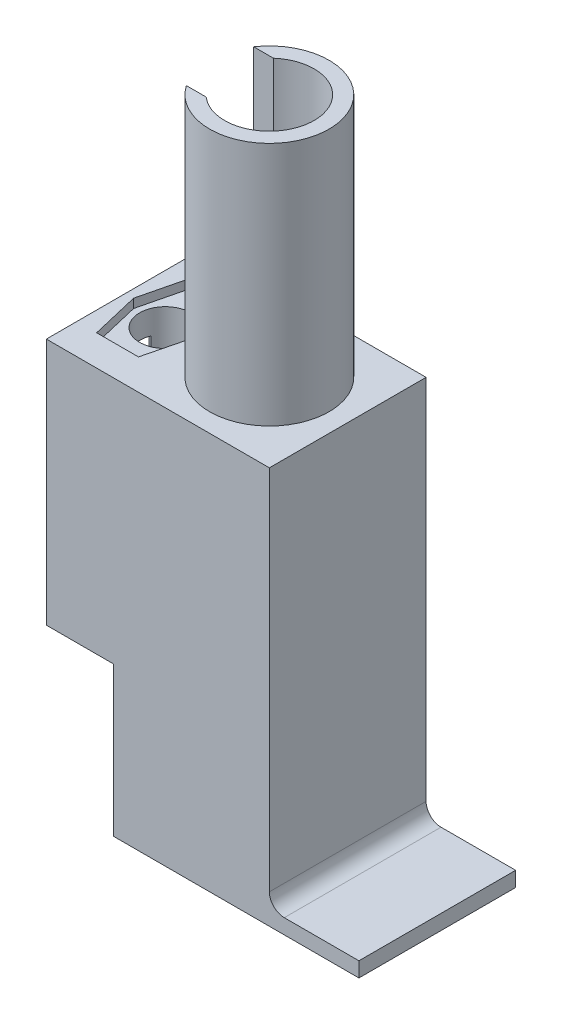
ISO-10303-21;
HEADER;
FILE_DESCRIPTION(('STEP AP214'),'2;1');
FILE_NAME('part.step','',(''),(''),'','','');
FILE_SCHEMA(('AUTOMOTIVE_DESIGN { 1 0 10303 214 1 1 1 1 }'));
ENDSEC;
DATA;
#1=APPLICATION_CONTEXT('core data for automotive mechanical design processes');
#2=APPLICATION_PROTOCOL_DEFINITION('international standard','automotive_design',2000,#1);
#3=PRODUCT_CONTEXT('',#1,'mechanical');
#4=PRODUCT('Part','Part','',(#3));
#5=PRODUCT_RELATED_PRODUCT_CATEGORY('part','',(#4));
#6=PRODUCT_DEFINITION_FORMATION('','',#4);
#7=PRODUCT_DEFINITION_CONTEXT('part definition',#1,'design');
#8=PRODUCT_DEFINITION('design','',#6,#7);
#9=PRODUCT_DEFINITION_SHAPE('','',#8);
#10=(LENGTH_UNIT() NAMED_UNIT(*) SI_UNIT(.MILLI.,.METRE.));
#11=(NAMED_UNIT(*) PLANE_ANGLE_UNIT() SI_UNIT($,.RADIAN.));
#12=(NAMED_UNIT(*) SI_UNIT($,.STERADIAN.) SOLID_ANGLE_UNIT());
#13=UNCERTAINTY_MEASURE_WITH_UNIT(LENGTH_MEASURE(1.E-05),#10,'distance_accuracy_value','');
#14=(GEOMETRIC_REPRESENTATION_CONTEXT(3) GLOBAL_UNCERTAINTY_ASSIGNED_CONTEXT((#13)) GLOBAL_UNIT_ASSIGNED_CONTEXT((#10,
#11,#12)) REPRESENTATION_CONTEXT('',''));
#15=CARTESIAN_POINT('',(0.,0.,0.));
#16=DIRECTION('',(0.,0.,1.));
#17=DIRECTION('',(1.,0.,0.));
#18=AXIS2_PLACEMENT_3D('',#15,#16,#17);
#19=CARTESIAN_POINT('',(0.,83.,0.));
#20=DIRECTION('',(0.,1.,0.));
#21=DIRECTION('',(0.,0.,1.));
#22=AXIS2_PLACEMENT_3D('',#19,#20,#21);
#23=PLANE('',#22);
#24=DIRECTION('',(1.,0.,0.));
#25=VECTOR('',#24,1.);
#26=CARTESIAN_POINT('',(-30.75,83.,16.));
#27=LINE('',#26,#25);
#28=CARTESIAN_POINT('',(-30.75,83.,16.));
#29=VERTEX_POINT('',#28);
#30=CARTESIAN_POINT('',(-16.75,83.,16.));
#31=VERTEX_POINT('',#30);
#32=EDGE_CURVE('E281',#29,#31,#27,.T.);
#33=ORIENTED_EDGE('',*,*,#32,.F.);
#34=DIRECTION('',(-0.230534425709279,0.,-0.973064169807363));
#35=VECTOR('',#34,1.);
#36=CARTESIAN_POINT('',(-30.75,83.,16.));
#37=LINE('',#36,#35);
#38=CARTESIAN_POINT('',(-34.5964592664,83.,-0.235543482244875));
#39=VERTEX_POINT('',#38);
#40=EDGE_CURVE('E66',#29,#39,#37,.T.);
#41=ORIENTED_EDGE('',*,*,#40,.T.);
#42=DIRECTION('',(-0.237041675476932,0.,0.971499482288636));
#43=VECTOR('',#42,1.);
#44=CARTESIAN_POINT('',(-30.75,83.,-16.));
#45=LINE('',#44,#43);
#46=CARTESIAN_POINT('',(-30.75,83.,-16.));
#47=VERTEX_POINT('',#46);
#48=EDGE_CURVE('E302',#47,#39,#45,.T.);
#49=ORIENTED_EDGE('',*,*,#48,.F.);
#50=DIRECTION('',(1.,0.,0.));
#51=VECTOR('',#50,1.);
#52=CARTESIAN_POINT('',(-30.75,83.,-16.));
#53=LINE('',#52,#51);
#54=CARTESIAN_POINT('',(-16.75,83.,-16.));
#55=VERTEX_POINT('',#54);
#56=EDGE_CURVE('E306',#47,#55,#53,.T.);
#57=ORIENTED_EDGE('',*,*,#56,.T.);
#58=DIRECTION('',(0.238368548536273,0.,0.971174770609652));
#59=VECTOR('',#58,1.);
#60=CARTESIAN_POINT('',(-16.75,83.,-16.));
#61=LINE('',#60,#59);
#62=CARTESIAN_POINT('',(-12.7885380264449,83.,0.140014893201441));
#63=VERTEX_POINT('',#62);
#64=EDGE_CURVE('E310',#55,#63,#61,.T.);
#65=ORIENTED_EDGE('',*,*,#64,.T.);
#66=DIRECTION('',(0.242332135649576,0.,-0.970193349818228));
#67=VECTOR('',#66,1.);
#68=CARTESIAN_POINT('',(-16.75,83.,16.));
#69=LINE('',#68,#67);
#70=EDGE_CURVE('E314',#31,#63,#69,.T.);
#71=ORIENTED_EDGE('',*,*,#70,.F.);
#72=EDGE_LOOP('',(#33,#41,#49,#57,#65,#71));
#73=FACE_BOUND('',#72,.T.);
#74=DIRECTION('',(0.,0.,-1.));
#75=VECTOR('',#74,1.);
#76=CARTESIAN_POINT('',(37.35,83.,-26.25));
#77=LINE('',#76,#75);
#78=CARTESIAN_POINT('',(37.35,83.,26.25));
#79=VERTEX_POINT('',#78);
#80=CARTESIAN_POINT('',(37.35,83.,-26.25));
#81=VERTEX_POINT('',#80);
#82=EDGE_CURVE('E487',#79,#81,#77,.T.);
#83=ORIENTED_EDGE('',*,*,#82,.T.);
#84=DIRECTION('',(-1.,0.,0.));
#85=VECTOR('',#84,1.);
#86=CARTESIAN_POINT('',(-37.35,83.,-26.25));
#87=LINE('',#86,#85);
#88=CARTESIAN_POINT('',(-37.35,83.,-26.25));
#89=VERTEX_POINT('',#88);
#90=EDGE_CURVE('E491',#81,#89,#87,.T.);
#91=ORIENTED_EDGE('',*,*,#90,.T.);
#92=DIRECTION('',(0.,0.,1.));
#93=VECTOR('',#92,1.);
#94=CARTESIAN_POINT('',(-37.35,83.,-26.25));
#95=LINE('',#94,#93);
#96=CARTESIAN_POINT('',(-37.35,83.,26.25));
#97=VERTEX_POINT('',#96);
#98=EDGE_CURVE('E495',#89,#97,#95,.T.);
#99=ORIENTED_EDGE('',*,*,#98,.T.);
#100=DIRECTION('',(1.,0.,0.));
#101=VECTOR('',#100,1.);
#102=CARTESIAN_POINT('',(-37.35,83.,26.25));
#103=LINE('',#102,#101);
#104=EDGE_CURVE('E498',#97,#79,#103,.T.);
#105=ORIENTED_EDGE('',*,*,#104,.T.);
#106=EDGE_LOOP('',(#83,#91,#99,#105));
#107=FACE_BOUND('',#106,.T.);
#108=CARTESIAN_POINT('',(11.1,83.,0.));
#109=DIRECTION('',(0.,1.,0.));
#110=DIRECTION('',(0.,0.,1.));
#111=AXIS2_PLACEMENT_3D('',#108,#109,#110);
#112=CIRCLE('',#111,20.);
#113=CARTESIAN_POINT('',(-5.42322625802538,83.,11.2686731262425));
#114=VERTEX_POINT('',#113);
#115=CARTESIAN_POINT('',(-5.42322625802539,83.,-11.2686731262425));
#116=VERTEX_POINT('',#115);
#117=EDGE_CURVE('E262',#114,#116,#112,.T.);
#118=ORIENTED_EDGE('',*,*,#117,.F.);
#119=DIRECTION('',(1.,0.,0.));
#120=VECTOR('',#119,1.);
#121=CARTESIAN_POINT('',(-5.42322625802538,83.,11.2686731262425));
#122=LINE('',#121,#120);
#123=CARTESIAN_POINT('',(1.19964616925739,83.,11.2686731262425));
#124=VERTEX_POINT('',#123);
#125=EDGE_CURVE('E245',#114,#124,#122,.T.);
#126=ORIENTED_EDGE('',*,*,#125,.T.);
#127=CARTESIAN_POINT('',(11.1,83.,0.));
#128=DIRECTION('',(0.,-1.,0.));
#129=DIRECTION('',(0.,0.,1.));
#130=AXIS2_PLACEMENT_3D('',#127,#128,#129);
#131=CIRCLE('',#130,15.);
#132=CARTESIAN_POINT('',(1.19964616925739,83.,-11.2686731262425));
#133=VERTEX_POINT('',#132);
#134=EDGE_CURVE('E254',#124,#133,#131,.T.);
#135=ORIENTED_EDGE('',*,*,#134,.T.);
#136=DIRECTION('',(-1.,0.,0.));
#137=VECTOR('',#136,1.);
#138=CARTESIAN_POINT('',(-5.42322625802538,83.,-11.2686731262425));
#139=LINE('',#138,#137);
#140=EDGE_CURVE('E58',#133,#116,#139,.T.);
#141=ORIENTED_EDGE('',*,*,#140,.T.);
#142=EDGE_LOOP('',(#118,#126,#135,#141));
#143=FACE_BOUND('',#142,.T.);
#144=ADVANCED_FACE('F41',(#73,#107,#143),#23,.T.);
#145=CARTESIAN_POINT('',(37.35,83.,-26.25));
#146=DIRECTION('',(-1.,0.,0.));
#147=DIRECTION('',(0.,0.,1.));
#148=AXIS2_PLACEMENT_3D('',#145,#146,#147);
#149=PLANE('',#148);
#150=DIRECTION('',(0.,-1.,0.));
#151=VECTOR('',#150,1.);
#152=CARTESIAN_POINT('',(37.35,83.,26.25));
#153=LINE('',#152,#151);
#154=CARTESIAN_POINT('',(37.35,-40.,26.25));
#155=VERTEX_POINT('',#154);
#156=EDGE_CURVE('E501',#79,#155,#153,.T.);
#157=ORIENTED_EDGE('',*,*,#156,.T.);
#158=DIRECTION('',(0.,0.,1.));
#159=VECTOR('',#158,1.);
#160=CARTESIAN_POINT('',(37.35,-40.,-26.25));
#161=LINE('',#160,#159);
#162=CARTESIAN_POINT('',(37.35,-40.,-26.25));
#163=VERTEX_POINT('',#162);
#164=EDGE_CURVE('E558',#155,#163,#161,.F.);
#165=ORIENTED_EDGE('',*,*,#164,.T.);
#166=DIRECTION('',(0.,-1.,0.));
#167=VECTOR('',#166,1.);
#168=CARTESIAN_POINT('',(37.35,83.,-26.25));
#169=LINE('',#168,#167);
#170=EDGE_CURVE('E521',#81,#163,#169,.T.);
#171=ORIENTED_EDGE('',*,*,#170,.F.);
#172=ORIENTED_EDGE('',*,*,#82,.F.);
#173=EDGE_LOOP('',(#157,#165,#171,#172));
#174=FACE_BOUND('',#173,.T.);
#175=ADVANCED_FACE('F573',(#174),#149,.F.);
#176=CARTESIAN_POINT('',(0.,0.,0.));
#177=DIRECTION('',(0.,1.,0.));
#178=DIRECTION('',(0.,0.,1.));
#179=AXIS2_PLACEMENT_3D('',#176,#177,#178);
#180=PLANE('',#179);
#181=CARTESIAN_POINT('',(-23.75,0.,0.));
#182=DIRECTION('',(0.,-1.,0.));
#183=DIRECTION('',(0.,0.,-1.));
#184=AXIS2_PLACEMENT_3D('',#181,#182,#183);
#185=CIRCLE('',#184,8.6);
#186=CARTESIAN_POINT('',(-23.75,0.,-8.59999999999998));
#187=VERTEX_POINT('',#186);
#188=EDGE_CURVE('E482',#187,#187,#185,.T.);
#189=ORIENTED_EDGE('',*,*,#188,.F.);
#190=EDGE_LOOP('',(#189));
#191=FACE_BOUND('',#190,.T.);
#192=DIRECTION('',(0.,0.,-1.));
#193=VECTOR('',#192,1.);
#194=CARTESIAN_POINT('',(-14.9,0.,26.25));
#195=LINE('',#194,#193);
#196=CARTESIAN_POINT('',(-14.9,0.,26.25));
#197=VERTEX_POINT('',#196);
#198=CARTESIAN_POINT('',(-14.9,0.,-26.25));
#199=VERTEX_POINT('',#198);
#200=EDGE_CURVE('E399',#197,#199,#195,.T.);
#201=ORIENTED_EDGE('',*,*,#200,.F.);
#202=DIRECTION('',(1.,0.,0.));
#203=VECTOR('',#202,1.);
#204=CARTESIAN_POINT('',(-37.35,0.,26.25));
#205=LINE('',#204,#203);
#206=CARTESIAN_POINT('',(-37.35,0.,26.25));
#207=VERTEX_POINT('',#206);
#208=EDGE_CURVE('E492',#207,#197,#205,.T.);
#209=ORIENTED_EDGE('',*,*,#208,.F.);
#210=DIRECTION('',(0.,0.,1.));
#211=VECTOR('',#210,1.);
#212=CARTESIAN_POINT('',(-37.35,0.,-26.25));
#213=LINE('',#212,#211);
#214=CARTESIAN_POINT('',(-37.35,0.,-26.25));
#215=VERTEX_POINT('',#214);
#216=EDGE_CURVE('E504',#215,#207,#213,.T.);
#217=ORIENTED_EDGE('',*,*,#216,.F.);
#218=DIRECTION('',(-1.,0.,0.));
#219=VECTOR('',#218,1.);
#220=CARTESIAN_POINT('',(-37.35,0.,-26.25));
#221=LINE('',#220,#219);
#222=EDGE_CURVE('E486',#199,#215,#221,.T.);
#223=ORIENTED_EDGE('',*,*,#222,.F.);
#224=EDGE_LOOP('',(#201,#209,#217,#223));
#225=FACE_BOUND('',#224,.T.);
#226=ADVANCED_FACE('F595',(#191,#225),#180,.F.);
#227=CARTESIAN_POINT('',(-32.36,0.,0.));
#228=DIRECTION('',(-1.,0.,0.));
#229=DIRECTION('',(0.,0.,1.));
#230=AXIS2_PLACEMENT_3D('',#227,#228,#229);
#231=PLANE('',#230);
#232=DIRECTION('',(0.,1.,0.));
#233=VECTOR('',#232,1.);
#234=CARTESIAN_POINT('',(-32.36,72.,3.19290980353145));
#235=LINE('',#234,#233);
#236=CARTESIAN_POINT('',(-32.36,11.,3.19290980353145));
#237=VERTEX_POINT('',#236);
#238=CARTESIAN_POINT('',(-32.36,72.,3.19290980353145));
#239=VERTEX_POINT('',#238);
#240=EDGE_CURVE('E430',#237,#239,#235,.T.);
#241=ORIENTED_EDGE('',*,*,#240,.F.);
#242=DIRECTION('',(0.,0.,1.));
#243=VECTOR('',#242,1.);
#244=CARTESIAN_POINT('',(-32.36,11.,-22.75));
#245=LINE('',#244,#243);
#246=CARTESIAN_POINT('',(-32.36,11.,22.75));
#247=VERTEX_POINT('',#246);
#248=EDGE_CURVE('E463',#237,#247,#245,.T.);
#249=ORIENTED_EDGE('',*,*,#248,.T.);
#250=DIRECTION('',(0.,1.,0.));
#251=VECTOR('',#250,1.);
#252=CARTESIAN_POINT('',(-32.36,72.,22.75));
#253=LINE('',#252,#251);
#254=CARTESIAN_POINT('',(-32.36,72.,22.75));
#255=VERTEX_POINT('',#254);
#256=EDGE_CURVE('E442',#247,#255,#253,.T.);
#257=ORIENTED_EDGE('',*,*,#256,.T.);
#258=DIRECTION('',(0.,0.,-1.));
#259=VECTOR('',#258,1.);
#260=CARTESIAN_POINT('',(-32.36,72.,-22.75));
#261=LINE('',#260,#259);
#262=EDGE_CURVE('E455',#255,#239,#261,.T.);
#263=ORIENTED_EDGE('',*,*,#262,.T.);
#264=EDGE_LOOP('',(#241,#249,#257,#263));
#265=FACE_BOUND('',#264,.T.);
#266=ADVANCED_FACE('F617',(#265),#231,.T.);
#267=CARTESIAN_POINT('',(-37.35,83.,-26.25));
#268=DIRECTION('',(1.,0.,0.));
#269=DIRECTION('',(0.,0.,-1.));
#270=AXIS2_PLACEMENT_3D('',#267,#268,#269);
#271=PLANE('',#270);
#272=ORIENTED_EDGE('',*,*,#216,.T.);
#273=DIRECTION('',(0.,-1.,0.));
#274=VECTOR('',#273,1.);
#275=CARTESIAN_POINT('',(-37.35,83.,26.25));
#276=LINE('',#275,#274);
#277=EDGE_CURVE('E513',#97,#207,#276,.T.);
#278=ORIENTED_EDGE('',*,*,#277,.F.);
#279=ORIENTED_EDGE('',*,*,#98,.F.);
#280=DIRECTION('',(0.,-1.,0.));
#281=VECTOR('',#280,1.);
#282=CARTESIAN_POINT('',(-37.35,83.,-26.25));
#283=LINE('',#282,#281);
#284=EDGE_CURVE('E517',#89,#215,#283,.T.);
#285=ORIENTED_EDGE('',*,*,#284,.T.);
#286=EDGE_LOOP('',(#272,#278,#279,#285));
#287=FACE_BOUND('',#286,.T.);
#288=DIRECTION('',(0.,1.,0.));
#289=VECTOR('',#288,1.);
#290=CARTESIAN_POINT('',(-37.35,83.,22.75));
#291=LINE('',#290,#289);
#292=CARTESIAN_POINT('',(-37.35,11.,22.75));
#293=VERTEX_POINT('',#292);
#294=CARTESIAN_POINT('',(-37.35,72.,22.75));
#295=VERTEX_POINT('',#294);
#296=EDGE_CURVE('E535',#293,#295,#291,.T.);
#297=ORIENTED_EDGE('',*,*,#296,.F.);
#298=DIRECTION('',(0.,0.,1.));
#299=VECTOR('',#298,1.);
#300=CARTESIAN_POINT('',(-37.35,11.,-26.25));
#301=LINE('',#300,#299);
#302=CARTESIAN_POINT('',(-37.35,11.,-22.75));
#303=VERTEX_POINT('',#302);
#304=EDGE_CURVE('E525',#303,#293,#301,.T.);
#305=ORIENTED_EDGE('',*,*,#304,.F.);
#306=DIRECTION('',(0.,-1.,0.));
#307=VECTOR('',#306,1.);
#308=CARTESIAN_POINT('',(-37.35,83.,-22.75));
#309=LINE('',#308,#307);
#310=CARTESIAN_POINT('',(-37.35,72.,-22.75));
#311=VERTEX_POINT('',#310);
#312=EDGE_CURVE('E528',#311,#303,#309,.T.);
#313=ORIENTED_EDGE('',*,*,#312,.F.);
#314=DIRECTION('',(0.,0.,-1.));
#315=VECTOR('',#314,1.);
#316=CARTESIAN_POINT('',(-37.35,72.,-26.25));
#317=LINE('',#316,#315);
#318=EDGE_CURVE('E532',#295,#311,#317,.T.);
#319=ORIENTED_EDGE('',*,*,#318,.F.);
#320=EDGE_LOOP('',(#297,#305,#313,#319));
#321=FACE_BOUND('',#320,.T.);
#322=ADVANCED_FACE('F600',(#287,#321),#271,.F.);
#323=CARTESIAN_POINT('',(-37.35,83.,-26.25));
#324=DIRECTION('',(0.,0.,1.));
#325=DIRECTION('',(1.,0.,0.));
#326=AXIS2_PLACEMENT_3D('',#323,#324,#325);
#327=PLANE('',#326);
#328=ORIENTED_EDGE('',*,*,#170,.T.);
#329=CARTESIAN_POINT('',(42.35,-40.,-26.25));
#330=DIRECTION('',(0.,0.,1.));
#331=DIRECTION('',(1.,0.,0.));
#332=AXIS2_PLACEMENT_3D('',#329,#330,#331);
#333=CIRCLE('',#332,5.);
#334=CARTESIAN_POINT('',(42.35,-45.,-26.25));
#335=VERTEX_POINT('',#334);
#336=EDGE_CURVE('E11',#163,#335,#333,.T.);
#337=ORIENTED_EDGE('',*,*,#336,.T.);
#338=DIRECTION('',(-1.,0.,0.));
#339=VECTOR('',#338,1.);
#340=CARTESIAN_POINT('',(67.35,-45.,-26.25));
#341=LINE('',#340,#339);
#342=CARTESIAN_POINT('',(67.35,-45.,-26.25));
#343=VERTEX_POINT('',#342);
#344=EDGE_CURVE('E360',#343,#335,#341,.T.);
#345=ORIENTED_EDGE('',*,*,#344,.F.);
#346=DIRECTION('',(0.,1.,0.));
#347=VECTOR('',#346,1.);
#348=CARTESIAN_POINT('',(67.35,-45.,-26.25));
#349=LINE('',#348,#347);
#350=CARTESIAN_POINT('',(67.35,-50.,-26.25));
#351=VERTEX_POINT('',#350);
#352=EDGE_CURVE('E350',#351,#343,#349,.T.);
#353=ORIENTED_EDGE('',*,*,#352,.F.);
#354=DIRECTION('',(1.,0.,0.));
#355=VECTOR('',#354,1.);
#356=CARTESIAN_POINT('',(-14.9,-50.,-26.25));
#357=LINE('',#356,#355);
#358=CARTESIAN_POINT('',(-14.9,-50.,-26.25));
#359=VERTEX_POINT('',#358);
#360=EDGE_CURVE('E413',#359,#351,#357,.T.);
#361=ORIENTED_EDGE('',*,*,#360,.F.);
#362=DIRECTION('',(0.,1.,0.));
#363=VECTOR('',#362,1.);
#364=CARTESIAN_POINT('',(-14.9,-50.,-26.25));
#365=LINE('',#364,#363);
#366=EDGE_CURVE('E426',#359,#199,#365,.T.);
#367=ORIENTED_EDGE('',*,*,#366,.T.);
#368=ORIENTED_EDGE('',*,*,#222,.T.);
#369=ORIENTED_EDGE('',*,*,#284,.F.);
#370=ORIENTED_EDGE('',*,*,#90,.F.);
#371=EDGE_LOOP('',(#328,#337,#345,#353,#361,#367,#368,#369,#370));
#372=FACE_BOUND('',#371,.T.);
#373=ADVANCED_FACE('F578',(#372),#327,.F.);
#374=CARTESIAN_POINT('',(-37.35,83.,26.25));
#375=DIRECTION('',(0.,0.,-1.));
#376=DIRECTION('',(-1.,0.,0.));
#377=AXIS2_PLACEMENT_3D('',#374,#375,#376);
#378=PLANE('',#377);
#379=ORIENTED_EDGE('',*,*,#208,.T.);
#380=DIRECTION('',(0.,1.,0.));
#381=VECTOR('',#380,1.);
#382=CARTESIAN_POINT('',(-14.9,-50.,26.25));
#383=LINE('',#382,#381);
#384=CARTESIAN_POINT('',(-14.9,-50.,26.25));
#385=VERTEX_POINT('',#384);
#386=EDGE_CURVE('E419',#385,#197,#383,.T.);
#387=ORIENTED_EDGE('',*,*,#386,.F.);
#388=DIRECTION('',(-1.,0.,0.));
#389=VECTOR('',#388,1.);
#390=CARTESIAN_POINT('',(-14.9,-50.,26.25));
#391=LINE('',#390,#389);
#392=CARTESIAN_POINT('',(67.35,-50.,26.25));
#393=VERTEX_POINT('',#392);
#394=EDGE_CURVE('E416',#393,#385,#391,.T.);
#395=ORIENTED_EDGE('',*,*,#394,.F.);
#396=DIRECTION('',(0.,-1.,0.));
#397=VECTOR('',#396,1.);
#398=CARTESIAN_POINT('',(67.35,-45.,26.25));
#399=LINE('',#398,#397);
#400=CARTESIAN_POINT('',(67.35,-45.,26.25));
#401=VERTEX_POINT('',#400);
#402=EDGE_CURVE('E342',#401,#393,#399,.T.);
#403=ORIENTED_EDGE('',*,*,#402,.F.);
#404=DIRECTION('',(-1.,0.,0.));
#405=VECTOR('',#404,1.);
#406=CARTESIAN_POINT('',(67.35,-45.,26.25));
#407=LINE('',#406,#405);
#408=CARTESIAN_POINT('',(42.35,-45.,26.25));
#409=VERTEX_POINT('',#408);
#410=EDGE_CURVE('E356',#401,#409,#407,.T.);
#411=ORIENTED_EDGE('',*,*,#410,.T.);
#412=CARTESIAN_POINT('',(42.35,-40.,26.25));
#413=DIRECTION('',(0.,0.,-1.));
#414=DIRECTION('',(-1.,0.,0.));
#415=AXIS2_PLACEMENT_3D('',#412,#413,#414);
#416=CIRCLE('',#415,5.);
#417=EDGE_CURVE('E51',#409,#155,#416,.T.);
#418=ORIENTED_EDGE('',*,*,#417,.T.);
#419=ORIENTED_EDGE('',*,*,#156,.F.);
#420=ORIENTED_EDGE('',*,*,#104,.F.);
#421=ORIENTED_EDGE('',*,*,#277,.T.);
#422=EDGE_LOOP('',(#379,#387,#395,#403,#411,#418,#419,#420,#421));
#423=FACE_BOUND('',#422,.T.);
#424=ADVANCED_FACE('F564',(#423),#378,.F.);
#425=CARTESIAN_POINT('',(-23.75,130.,0.));
#426=DIRECTION('',(0.,-1.,0.));
#427=DIRECTION('',(0.,0.,-1.));
#428=AXIS2_PLACEMENT_3D('',#425,#426,#427);
#429=CYLINDRICAL_SURFACE('',#428,8.6);
#430=CARTESIAN_POINT('',(-23.75,80.,0.));
#431=DIRECTION('',(0.,-1.,0.));
#432=DIRECTION('',(0.,0.,-1.));
#433=AXIS2_PLACEMENT_3D('',#430,#431,#432);
#434=CIRCLE('',#433,8.6);
#435=CARTESIAN_POINT('',(-23.75,80.,-8.59999999999998));
#436=VERTEX_POINT('',#435);
#437=EDGE_CURVE('E45',#436,#436,#434,.F.);
#438=ORIENTED_EDGE('',*,*,#437,.T.);
#439=EDGE_LOOP('',(#438));
#440=FACE_BOUND('',#439,.T.);
#441=CARTESIAN_POINT('',(-23.75,11.,0.));
#442=DIRECTION('',(0.,-1.,0.));
#443=DIRECTION('',(1.,0.,0.));
#444=AXIS2_PLACEMENT_3D('',#441,#442,#443);
#445=CIRCLE('',#444,8.6);
#446=CARTESIAN_POINT('',(-31.7353194667785,11.,-3.19290980353144));
#447=VERTEX_POINT('',#446);
#448=CARTESIAN_POINT('',(-31.7353194667786,11.,3.19290980353145));
#449=VERTEX_POINT('',#448);
#450=EDGE_CURVE('E546',#447,#449,#445,.F.);
#451=ORIENTED_EDGE('',*,*,#450,.T.);
#452=DIRECTION('',(0.,-1.,0.));
#453=VECTOR('',#452,1.);
#454=CARTESIAN_POINT('',(-31.7353194667786,130.,3.19290980353145));
#455=LINE('',#454,#453);
#456=CARTESIAN_POINT('',(-31.7353194667786,72.,3.19290980353145));
#457=VERTEX_POINT('',#456);
#458=EDGE_CURVE('E550',#449,#457,#455,.F.);
#459=ORIENTED_EDGE('',*,*,#458,.T.);
#460=CARTESIAN_POINT('',(-23.75,72.,0.));
#461=DIRECTION('',(0.,1.,0.));
#462=DIRECTION('',(-1.,0.,0.));
#463=AXIS2_PLACEMENT_3D('',#460,#461,#462);
#464=CIRCLE('',#463,8.6);
#465=CARTESIAN_POINT('',(-31.7353194667785,72.,-3.19290980353144));
#466=VERTEX_POINT('',#465);
#467=EDGE_CURVE('E538',#457,#466,#464,.F.);
#468=ORIENTED_EDGE('',*,*,#467,.T.);
#469=DIRECTION('',(0.,-1.,0.));
#470=VECTOR('',#469,1.);
#471=CARTESIAN_POINT('',(-31.7353194667785,130.,-3.19290980353144));
#472=LINE('',#471,#470);
#473=EDGE_CURVE('E542',#466,#447,#472,.T.);
#474=ORIENTED_EDGE('',*,*,#473,.T.);
#475=EDGE_LOOP('',(#451,#459,#468,#474));
#476=FACE_BOUND('',#475,.T.);
#477=ORIENTED_EDGE('',*,*,#188,.T.);
#478=EDGE_LOOP('',(#477));
#479=FACE_BOUND('',#478,.T.);
#480=ADVANCED_FACE('F613',(#440,#476,#479),#429,.F.);
#481=CARTESIAN_POINT('',(-37.350012,72.,22.75));
#482=DIRECTION('',(0.,0.,-1.));
#483=DIRECTION('',(-1.,0.,0.));
#484=AXIS2_PLACEMENT_3D('',#481,#482,#483);
#485=PLANE('',#484);
#486=ORIENTED_EDGE('',*,*,#296,.T.);
#487=DIRECTION('',(1.,0.,0.));
#488=VECTOR('',#487,1.);
#489=CARTESIAN_POINT('',(-37.350012,72.,22.75));
#490=LINE('',#489,#488);
#491=EDGE_CURVE('E479',#295,#255,#490,.T.);
#492=ORIENTED_EDGE('',*,*,#491,.T.);
#493=ORIENTED_EDGE('',*,*,#256,.F.);
#494=DIRECTION('',(1.,0.,0.));
#495=VECTOR('',#494,1.);
#496=CARTESIAN_POINT('',(-37.350012,11.,22.75));
#497=LINE('',#496,#495);
#498=EDGE_CURVE('E468',#293,#247,#497,.T.);
#499=ORIENTED_EDGE('',*,*,#498,.F.);
#500=EDGE_LOOP('',(#486,#492,#493,#499));
#501=FACE_BOUND('',#500,.T.);
#502=ADVANCED_FACE('F641',(#501),#485,.T.);
#503=CARTESIAN_POINT('',(-37.350012,72.,-22.75));
#504=DIRECTION('',(0.,-1.,0.));
#505=DIRECTION('',(0.,0.,-1.));
#506=AXIS2_PLACEMENT_3D('',#503,#504,#505);
#507=PLANE('',#506);
#508=ORIENTED_EDGE('',*,*,#318,.T.);
#509=DIRECTION('',(1.,0.,0.));
#510=VECTOR('',#509,1.);
#511=CARTESIAN_POINT('',(-37.350012,72.,-22.75));
#512=LINE('',#511,#510);
#513=CARTESIAN_POINT('',(-32.36,72.,-22.75));
#514=VERTEX_POINT('',#513);
#515=EDGE_CURVE('E475',#311,#514,#512,.T.);
#516=ORIENTED_EDGE('',*,*,#515,.T.);
#517=CARTESIAN_POINT('',(-32.36,72.,-3.19290980353144));
#518=VERTEX_POINT('',#517);
#519=EDGE_CURVE('E454',#518,#514,#261,.T.);
#520=ORIENTED_EDGE('',*,*,#519,.F.);
#521=DIRECTION('',(-1.,0.,0.));
#522=VECTOR('',#521,1.);
#523=CARTESIAN_POINT('',(-31.36,72.,-3.19290980353144));
#524=LINE('',#523,#522);
#525=EDGE_CURVE('E446',#466,#518,#524,.T.);
#526=ORIENTED_EDGE('',*,*,#525,.F.);
#527=ORIENTED_EDGE('',*,*,#467,.F.);
#528=DIRECTION('',(-1.,0.,0.));
#529=VECTOR('',#528,1.);
#530=CARTESIAN_POINT('',(-31.36,72.,3.19290980353145));
#531=LINE('',#530,#529);
#532=EDGE_CURVE('E438',#457,#239,#531,.T.);
#533=ORIENTED_EDGE('',*,*,#532,.T.);
#534=ORIENTED_EDGE('',*,*,#262,.F.);
#535=ORIENTED_EDGE('',*,*,#491,.F.);
#536=EDGE_LOOP('',(#508,#516,#520,#526,#527,#533,#534,#535));
#537=FACE_BOUND('',#536,.T.);
#538=ADVANCED_FACE('F650',(#537),#507,.T.);
#539=CARTESIAN_POINT('',(-37.350012,72.,-22.75));
#540=DIRECTION('',(0.,0.,1.));
#541=DIRECTION('',(1.,0.,0.));
#542=AXIS2_PLACEMENT_3D('',#539,#540,#541);
#543=PLANE('',#542);
#544=ORIENTED_EDGE('',*,*,#312,.T.);
#545=DIRECTION('',(1.,0.,0.));
#546=VECTOR('',#545,1.);
#547=CARTESIAN_POINT('',(-37.350012,11.,-22.75));
#548=LINE('',#547,#546);
#549=CARTESIAN_POINT('',(-32.36,11.,-22.75));
#550=VERTEX_POINT('',#549);
#551=EDGE_CURVE('E472',#303,#550,#548,.T.);
#552=ORIENTED_EDGE('',*,*,#551,.T.);
#553=DIRECTION('',(0.,-1.,0.));
#554=VECTOR('',#553,1.);
#555=CARTESIAN_POINT('',(-32.36,72.,-22.75));
#556=LINE('',#555,#554);
#557=EDGE_CURVE('E459',#514,#550,#556,.T.);
#558=ORIENTED_EDGE('',*,*,#557,.F.);
#559=ORIENTED_EDGE('',*,*,#515,.F.);
#560=EDGE_LOOP('',(#544,#552,#558,#559));
#561=FACE_BOUND('',#560,.T.);
#562=ADVANCED_FACE('F658',(#561),#543,.T.);
#563=CARTESIAN_POINT('',(-37.350012,11.,-22.75));
#564=DIRECTION('',(0.,1.,0.));
#565=DIRECTION('',(0.,0.,1.));
#566=AXIS2_PLACEMENT_3D('',#563,#564,#565);
#567=PLANE('',#566);
#568=ORIENTED_EDGE('',*,*,#304,.T.);
#569=ORIENTED_EDGE('',*,*,#498,.T.);
#570=ORIENTED_EDGE('',*,*,#248,.F.);
#571=DIRECTION('',(-1.,0.,0.));
#572=VECTOR('',#571,1.);
#573=CARTESIAN_POINT('',(-31.36,11.,3.19290980353145));
#574=LINE('',#573,#572);
#575=EDGE_CURVE('E439',#449,#237,#574,.T.);
#576=ORIENTED_EDGE('',*,*,#575,.F.);
#577=ORIENTED_EDGE('',*,*,#450,.F.);
#578=DIRECTION('',(-1.,0.,0.));
#579=VECTOR('',#578,1.);
#580=CARTESIAN_POINT('',(-31.36,11.,-3.19290980353144));
#581=LINE('',#580,#579);
#582=CARTESIAN_POINT('',(-32.36,11.,-3.19290980353144));
#583=VERTEX_POINT('',#582);
#584=EDGE_CURVE('E443',#447,#583,#581,.T.);
#585=ORIENTED_EDGE('',*,*,#584,.T.);
#586=EDGE_CURVE('E464',#550,#583,#245,.T.);
#587=ORIENTED_EDGE('',*,*,#586,.F.);
#588=ORIENTED_EDGE('',*,*,#551,.F.);
#589=EDGE_LOOP('',(#568,#569,#570,#576,#577,#585,#587,#588));
#590=FACE_BOUND('',#589,.T.);
#591=ADVANCED_FACE('F667',(#590),#567,.T.);
#592=DIRECTION('',(0.,-1.,0.));
#593=VECTOR('',#592,1.);
#594=CARTESIAN_POINT('',(-32.36,72.,-3.19290980353144));
#595=LINE('',#594,#593);
#596=EDGE_CURVE('E434',#518,#583,#595,.T.);
#597=ORIENTED_EDGE('',*,*,#596,.F.);
#598=ORIENTED_EDGE('',*,*,#519,.T.);
#599=ORIENTED_EDGE('',*,*,#557,.T.);
#600=ORIENTED_EDGE('',*,*,#586,.T.);
#601=EDGE_LOOP('',(#597,#598,#599,#600));
#602=FACE_BOUND('',#601,.T.);
#603=ADVANCED_FACE('F674',(#602),#231,.T.);
#604=CARTESIAN_POINT('',(-31.36,72.,3.19290980353145));
#605=DIRECTION('',(0.,0.,1.));
#606=DIRECTION('',(1.,0.,0.));
#607=AXIS2_PLACEMENT_3D('',#604,#605,#606);
#608=PLANE('',#607);
#609=ORIENTED_EDGE('',*,*,#575,.T.);
#610=ORIENTED_EDGE('',*,*,#240,.T.);
#611=ORIENTED_EDGE('',*,*,#532,.F.);
#612=ORIENTED_EDGE('',*,*,#458,.F.);
#613=EDGE_LOOP('',(#609,#610,#611,#612));
#614=FACE_BOUND('',#613,.T.);
#615=ADVANCED_FACE('F682',(#614),#608,.F.);
#616=CARTESIAN_POINT('',(-31.36,72.,-3.19290980353144));
#617=DIRECTION('',(0.,0.,-1.));
#618=DIRECTION('',(-1.,0.,0.));
#619=AXIS2_PLACEMENT_3D('',#616,#617,#618);
#620=PLANE('',#619);
#621=ORIENTED_EDGE('',*,*,#525,.T.);
#622=ORIENTED_EDGE('',*,*,#596,.T.);
#623=ORIENTED_EDGE('',*,*,#584,.F.);
#624=ORIENTED_EDGE('',*,*,#473,.F.);
#625=EDGE_LOOP('',(#621,#622,#623,#624));
#626=FACE_BOUND('',#625,.T.);
#627=ADVANCED_FACE('F690',(#626),#620,.F.);
#628=CARTESIAN_POINT('',(-14.9,-50.,26.25));
#629=DIRECTION('',(1.,0.,0.));
#630=DIRECTION('',(0.,0.,-1.));
#631=AXIS2_PLACEMENT_3D('',#628,#629,#630);
#632=PLANE('',#631);
#633=ORIENTED_EDGE('',*,*,#200,.T.);
#634=ORIENTED_EDGE('',*,*,#366,.F.);
#635=DIRECTION('',(0.,0.,-1.));
#636=VECTOR('',#635,1.);
#637=CARTESIAN_POINT('',(-14.9,-50.,26.25));
#638=LINE('',#637,#636);
#639=EDGE_CURVE('E409',#385,#359,#638,.T.);
#640=ORIENTED_EDGE('',*,*,#639,.F.);
#641=ORIENTED_EDGE('',*,*,#386,.T.);
#642=EDGE_LOOP('',(#633,#634,#640,#641));
#643=FACE_BOUND('',#642,.T.);
#644=ADVANCED_FACE('F592',(#643),#632,.F.);
#645=CARTESIAN_POINT('',(0.,-50.,0.));
#646=DIRECTION('',(0.,-1.,0.));
#647=DIRECTION('',(0.,0.,-1.));
#648=AXIS2_PLACEMENT_3D('',#645,#646,#647);
#649=PLANE('',#648);
#650=DIRECTION('',(0.,0.,1.));
#651=VECTOR('',#650,1.);
#652=CARTESIAN_POINT('',(32.35,-50.,21.25));
#653=LINE('',#652,#651);
#654=CARTESIAN_POINT('',(32.35,-50.,-21.25));
#655=VERTEX_POINT('',#654);
#656=CARTESIAN_POINT('',(32.35,-50.,21.25));
#657=VERTEX_POINT('',#656);
#658=EDGE_CURVE('E364',#655,#657,#653,.T.);
#659=ORIENTED_EDGE('',*,*,#658,.F.);
#660=DIRECTION('',(1.,0.,0.));
#661=VECTOR('',#660,1.);
#662=CARTESIAN_POINT('',(-10.15,-50.,-21.25));
#663=LINE('',#662,#661);
#664=CARTESIAN_POINT('',(-10.15,-50.,-21.25));
#665=VERTEX_POINT('',#664);
#666=EDGE_CURVE('E370',#665,#655,#663,.T.);
#667=ORIENTED_EDGE('',*,*,#666,.F.);
#668=DIRECTION('',(0.,0.,-1.));
#669=VECTOR('',#668,1.);
#670=CARTESIAN_POINT('',(-10.15,-50.,21.25));
#671=LINE('',#670,#669);
#672=CARTESIAN_POINT('',(-10.15,-50.,21.25));
#673=VERTEX_POINT('',#672);
#674=EDGE_CURVE('E389',#673,#665,#671,.T.);
#675=ORIENTED_EDGE('',*,*,#674,.F.);
#676=DIRECTION('',(-1.,0.,0.));
#677=VECTOR('',#676,1.);
#678=CARTESIAN_POINT('',(-10.15,-50.,21.25));
#679=LINE('',#678,#677);
#680=EDGE_CURVE('E385',#657,#673,#679,.T.);
#681=ORIENTED_EDGE('',*,*,#680,.F.);
#682=EDGE_LOOP('',(#659,#667,#675,#681));
#683=FACE_BOUND('',#682,.T.);
#684=ORIENTED_EDGE('',*,*,#639,.T.);
#685=ORIENTED_EDGE('',*,*,#360,.T.);
#686=DIRECTION('',(0.,0.,-1.));
#687=VECTOR('',#686,1.);
#688=CARTESIAN_POINT('',(67.35,-50.,26.25));
#689=LINE('',#688,#687);
#690=EDGE_CURVE('E346',#393,#351,#689,.T.);
#691=ORIENTED_EDGE('',*,*,#690,.F.);
#692=ORIENTED_EDGE('',*,*,#394,.T.);
#693=EDGE_LOOP('',(#684,#685,#691,#692));
#694=FACE_BOUND('',#693,.T.);
#695=ADVANCED_FACE('F589',(#683,#694),#649,.T.);
#696=CARTESIAN_POINT('',(32.35,-26.5,21.25));
#697=DIRECTION('',(1.,0.,0.));
#698=DIRECTION('',(0.,0.,-1.));
#699=AXIS2_PLACEMENT_3D('',#696,#697,#698);
#700=PLANE('',#699);
#701=ORIENTED_EDGE('',*,*,#658,.T.);
#702=DIRECTION('',(0.,-1.,0.));
#703=VECTOR('',#702,1.);
#704=CARTESIAN_POINT('',(32.35,-26.5,21.25));
#705=LINE('',#704,#703);
#706=CARTESIAN_POINT('',(32.35,-26.5,21.25));
#707=VERTEX_POINT('',#706);
#708=EDGE_CURVE('E382',#707,#657,#705,.T.);
#709=ORIENTED_EDGE('',*,*,#708,.F.);
#710=DIRECTION('',(0.,0.,1.));
#711=VECTOR('',#710,1.);
#712=CARTESIAN_POINT('',(32.35,-26.5,21.25));
#713=LINE('',#712,#711);
#714=CARTESIAN_POINT('',(32.35,-26.5,-21.25));
#715=VERTEX_POINT('',#714);
#716=EDGE_CURVE('E365',#715,#707,#713,.T.);
#717=ORIENTED_EDGE('',*,*,#716,.F.);
#718=DIRECTION('',(0.,-1.,0.));
#719=VECTOR('',#718,1.);
#720=CARTESIAN_POINT('',(32.35,-26.5,-21.25));
#721=LINE('',#720,#719);
#722=EDGE_CURVE('E396',#715,#655,#721,.T.);
#723=ORIENTED_EDGE('',*,*,#722,.T.);
#724=EDGE_LOOP('',(#701,#709,#717,#723));
#725=FACE_BOUND('',#724,.T.);
#726=ADVANCED_FACE('F713',(#725),#700,.F.);
#727=CARTESIAN_POINT('',(-10.15,-26.5,-21.25));
#728=DIRECTION('',(0.,0.,-1.));
#729=DIRECTION('',(-1.,0.,0.));
#730=AXIS2_PLACEMENT_3D('',#727,#728,#729);
#731=PLANE('',#730);
#732=ORIENTED_EDGE('',*,*,#666,.T.);
#733=ORIENTED_EDGE('',*,*,#722,.F.);
#734=DIRECTION('',(1.,0.,0.));
#735=VECTOR('',#734,1.);
#736=CARTESIAN_POINT('',(-10.15,-26.5,-21.25));
#737=LINE('',#736,#735);
#738=CARTESIAN_POINT('',(-10.15,-26.5,-21.25));
#739=VERTEX_POINT('',#738);
#740=EDGE_CURVE('E378',#739,#715,#737,.T.);
#741=ORIENTED_EDGE('',*,*,#740,.F.);
#742=DIRECTION('',(0.,-1.,0.));
#743=VECTOR('',#742,1.);
#744=CARTESIAN_POINT('',(-10.15,-26.5,-21.25));
#745=LINE('',#744,#743);
#746=EDGE_CURVE('E400',#739,#665,#745,.T.);
#747=ORIENTED_EDGE('',*,*,#746,.T.);
#748=EDGE_LOOP('',(#732,#733,#741,#747));
#749=FACE_BOUND('',#748,.T.);
#750=ADVANCED_FACE('F722',(#749),#731,.F.);
#751=CARTESIAN_POINT('',(-10.15,-26.5,21.25));
#752=DIRECTION('',(-1.,0.,0.));
#753=DIRECTION('',(0.,0.,1.));
#754=AXIS2_PLACEMENT_3D('',#751,#752,#753);
#755=PLANE('',#754);
#756=ORIENTED_EDGE('',*,*,#674,.T.);
#757=ORIENTED_EDGE('',*,*,#746,.F.);
#758=DIRECTION('',(0.,0.,-1.));
#759=VECTOR('',#758,1.);
#760=CARTESIAN_POINT('',(-10.15,-26.5,21.25));
#761=LINE('',#760,#759);
#762=CARTESIAN_POINT('',(-10.15,-26.5,21.25));
#763=VERTEX_POINT('',#762);
#764=EDGE_CURVE('E374',#763,#739,#761,.T.);
#765=ORIENTED_EDGE('',*,*,#764,.F.);
#766=DIRECTION('',(0.,-1.,0.));
#767=VECTOR('',#766,1.);
#768=CARTESIAN_POINT('',(-10.15,-26.5,21.25));
#769=LINE('',#768,#767);
#770=EDGE_CURVE('E403',#763,#673,#769,.T.);
#771=ORIENTED_EDGE('',*,*,#770,.T.);
#772=EDGE_LOOP('',(#756,#757,#765,#771));
#773=FACE_BOUND('',#772,.T.);
#774=ADVANCED_FACE('F730',(#773),#755,.F.);
#775=CARTESIAN_POINT('',(-10.15,-26.5,21.25));
#776=DIRECTION('',(0.,0.,1.));
#777=DIRECTION('',(1.,0.,0.));
#778=AXIS2_PLACEMENT_3D('',#775,#776,#777);
#779=PLANE('',#778);
#780=ORIENTED_EDGE('',*,*,#680,.T.);
#781=ORIENTED_EDGE('',*,*,#770,.F.);
#782=DIRECTION('',(-1.,0.,0.));
#783=VECTOR('',#782,1.);
#784=CARTESIAN_POINT('',(-10.15,-26.5,21.25));
#785=LINE('',#784,#783);
#786=EDGE_CURVE('E369',#707,#763,#785,.T.);
#787=ORIENTED_EDGE('',*,*,#786,.F.);
#788=ORIENTED_EDGE('',*,*,#708,.T.);
#789=EDGE_LOOP('',(#780,#781,#787,#788));
#790=FACE_BOUND('',#789,.T.);
#791=ADVANCED_FACE('F738',(#790),#779,.F.);
#792=CARTESIAN_POINT('',(0.,-26.5,0.));
#793=DIRECTION('',(0.,-1.,0.));
#794=DIRECTION('',(0.,0.,-1.));
#795=AXIS2_PLACEMENT_3D('',#792,#793,#794);
#796=PLANE('',#795);
#797=CARTESIAN_POINT('',(11.1,-26.5,0.));
#798=DIRECTION('',(0.,-1.,0.));
#799=DIRECTION('',(0.,0.,-1.));
#800=AXIS2_PLACEMENT_3D('',#797,#798,#799);
#801=CIRCLE('',#800,15.);
#802=CARTESIAN_POINT('',(11.1,-26.5,-15.));
#803=VERTEX_POINT('',#802);
#804=EDGE_CURVE('E338',#803,#803,#801,.T.);
#805=ORIENTED_EDGE('',*,*,#804,.F.);
#806=EDGE_LOOP('',(#805));
#807=FACE_BOUND('',#806,.T.);
#808=ORIENTED_EDGE('',*,*,#716,.T.);
#809=ORIENTED_EDGE('',*,*,#786,.T.);
#810=ORIENTED_EDGE('',*,*,#764,.T.);
#811=ORIENTED_EDGE('',*,*,#740,.T.);
#812=EDGE_LOOP('',(#808,#809,#810,#811));
#813=FACE_BOUND('',#812,.T.);
#814=ADVANCED_FACE('F745',(#807,#813),#796,.T.);
#815=CARTESIAN_POINT('',(67.35,-45.,26.25));
#816=DIRECTION('',(0.,-1.,0.));
#817=DIRECTION('',(0.,0.,-1.));
#818=AXIS2_PLACEMENT_3D('',#815,#816,#817);
#819=PLANE('',#818);
#820=ORIENTED_EDGE('',*,*,#344,.T.);
#821=DIRECTION('',(0.,0.,1.));
#822=VECTOR('',#821,1.);
#823=CARTESIAN_POINT('',(42.35,-45.,26.25));
#824=LINE('',#823,#822);
#825=EDGE_CURVE('E554',#335,#409,#824,.T.);
#826=ORIENTED_EDGE('',*,*,#825,.T.);
#827=ORIENTED_EDGE('',*,*,#410,.F.);
#828=DIRECTION('',(0.,0.,1.));
#829=VECTOR('',#828,1.);
#830=CARTESIAN_POINT('',(67.35,-45.,26.25));
#831=LINE('',#830,#829);
#832=EDGE_CURVE('E353',#343,#401,#831,.T.);
#833=ORIENTED_EDGE('',*,*,#832,.F.);
#834=EDGE_LOOP('',(#820,#826,#827,#833));
#835=FACE_BOUND('',#834,.T.);
#836=ADVANCED_FACE('F582',(#835),#819,.F.);
#837=CARTESIAN_POINT('',(67.35,0.,0.));
#838=DIRECTION('',(1.,0.,0.));
#839=DIRECTION('',(0.,0.,-1.));
#840=AXIS2_PLACEMENT_3D('',#837,#838,#839);
#841=PLANE('',#840);
#842=ORIENTED_EDGE('',*,*,#402,.T.);
#843=ORIENTED_EDGE('',*,*,#690,.T.);
#844=ORIENTED_EDGE('',*,*,#352,.T.);
#845=ORIENTED_EDGE('',*,*,#832,.T.);
#846=EDGE_LOOP('',(#842,#843,#844,#845));
#847=FACE_BOUND('',#846,.T.);
#848=ADVANCED_FACE('F584',(#847),#841,.T.);
#849=CARTESIAN_POINT('',(42.35,-40.,26.25));
#850=DIRECTION('',(0.,0.,-1.));
#851=DIRECTION('',(-1.,0.,0.));
#852=AXIS2_PLACEMENT_3D('',#849,#850,#851);
#853=CYLINDRICAL_SURFACE('',#852,5.);
#854=ORIENTED_EDGE('',*,*,#336,.F.);
#855=ORIENTED_EDGE('',*,*,#164,.F.);
#856=ORIENTED_EDGE('',*,*,#417,.F.);
#857=ORIENTED_EDGE('',*,*,#825,.F.);
#858=EDGE_LOOP('',(#854,#855,#856,#857));
#859=FACE_BOUND('',#858,.T.);
#860=ADVANCED_FACE('F43',(#859),#853,.F.);
#861=CARTESIAN_POINT('',(11.1,93.5,0.));
#862=DIRECTION('',(0.,-1.,0.));
#863=DIRECTION('',(0.,0.,-1.));
#864=AXIS2_PLACEMENT_3D('',#861,#862,#863);
#865=CYLINDRICAL_SURFACE('',#864,15.);
#866=CARTESIAN_POINT('',(11.1,165.,0.));
#867=DIRECTION('',(0.,1.,0.));
#868=DIRECTION('',(0.,0.,1.));
#869=AXIS2_PLACEMENT_3D('',#866,#867,#868);
#870=CIRCLE('',#869,15.);
#871=CARTESIAN_POINT('',(1.19964616925739,165.,11.2686731262425));
#872=VERTEX_POINT('',#871);
#873=CARTESIAN_POINT('',(1.19964616925739,165.,-11.2686731262425));
#874=VERTEX_POINT('',#873);
#875=EDGE_CURVE('E268',#872,#874,#870,.T.);
#876=ORIENTED_EDGE('',*,*,#875,.T.);
#877=DIRECTION('',(0.,1.,0.));
#878=VECTOR('',#877,1.);
#879=CARTESIAN_POINT('',(1.19964616925739,83.,-11.2686731262425));
#880=LINE('',#879,#878);
#881=EDGE_CURVE('E1011',#133,#874,#880,.T.);
#882=ORIENTED_EDGE('',*,*,#881,.F.);
#883=ORIENTED_EDGE('',*,*,#134,.F.);
#884=DIRECTION('',(0.,1.,0.));
#885=VECTOR('',#884,1.);
#886=CARTESIAN_POINT('',(1.19964616925739,83.,11.2686731262425));
#887=LINE('',#886,#885);
#888=EDGE_CURVE('E251',#124,#872,#887,.T.);
#889=ORIENTED_EDGE('',*,*,#888,.T.);
#890=EDGE_LOOP('',(#876,#882,#883,#889));
#891=FACE_BOUND('',#890,.T.);
#892=ORIENTED_EDGE('',*,*,#804,.T.);
#893=EDGE_LOOP('',(#892));
#894=FACE_BOUND('',#893,.T.);
#895=ADVANCED_FACE('F769',(#891,#894),#865,.F.);
#896=CARTESIAN_POINT('',(0.,80.,0.));
#897=DIRECTION('',(0.,-1.,0.));
#898=DIRECTION('',(0.,0.,-1.));
#899=AXIS2_PLACEMENT_3D('',#896,#897,#898);
#900=PLANE('',#899);
#901=DIRECTION('',(-0.230534425709279,0.,-0.973064169807363));
#902=VECTOR('',#901,1.);
#903=CARTESIAN_POINT('',(-30.75,80.,16.));
#904=LINE('',#903,#902);
#905=CARTESIAN_POINT('',(-30.75,80.,16.));
#906=VERTEX_POINT('',#905);
#907=CARTESIAN_POINT('',(-34.5964592664,80.,-0.235543482244875));
#908=VERTEX_POINT('',#907);
#909=EDGE_CURVE('E277',#906,#908,#904,.T.);
#910=ORIENTED_EDGE('',*,*,#909,.F.);
#911=DIRECTION('',(1.,0.,0.));
#912=VECTOR('',#911,1.);
#913=CARTESIAN_POINT('',(-30.75,80.,16.));
#914=LINE('',#913,#912);
#915=CARTESIAN_POINT('',(-16.75,80.,16.));
#916=VERTEX_POINT('',#915);
#917=EDGE_CURVE('E295',#906,#916,#914,.T.);
#918=ORIENTED_EDGE('',*,*,#917,.T.);
#919=DIRECTION('',(0.242332135649576,0.,-0.970193349818228));
#920=VECTOR('',#919,1.);
#921=CARTESIAN_POINT('',(-16.75,80.,16.));
#922=LINE('',#921,#920);
#923=CARTESIAN_POINT('',(-12.7885380264449,80.,0.140014893201441));
#924=VERTEX_POINT('',#923);
#925=EDGE_CURVE('E291',#916,#924,#922,.T.);
#926=ORIENTED_EDGE('',*,*,#925,.T.);
#927=DIRECTION('',(0.238368548536273,0.,0.971174770609652));
#928=VECTOR('',#927,1.);
#929=CARTESIAN_POINT('',(-16.75,80.,-16.));
#930=LINE('',#929,#928);
#931=CARTESIAN_POINT('',(-16.75,80.,-16.));
#932=VERTEX_POINT('',#931);
#933=EDGE_CURVE('E288',#932,#924,#930,.T.);
#934=ORIENTED_EDGE('',*,*,#933,.F.);
#935=DIRECTION('',(1.,0.,0.));
#936=VECTOR('',#935,1.);
#937=CARTESIAN_POINT('',(-30.75,80.,-16.));
#938=LINE('',#937,#936);
#939=CARTESIAN_POINT('',(-30.75,80.,-16.));
#940=VERTEX_POINT('',#939);
#941=EDGE_CURVE('E285',#940,#932,#938,.T.);
#942=ORIENTED_EDGE('',*,*,#941,.F.);
#943=DIRECTION('',(-0.237041675476932,0.,0.971499482288636));
#944=VECTOR('',#943,1.);
#945=CARTESIAN_POINT('',(-30.75,80.,-16.));
#946=LINE('',#945,#944);
#947=EDGE_CURVE('E280',#940,#908,#946,.T.);
#948=ORIENTED_EDGE('',*,*,#947,.T.);
#949=EDGE_LOOP('',(#910,#918,#926,#934,#942,#948));
#950=FACE_BOUND('',#949,.T.);
#951=ORIENTED_EDGE('',*,*,#437,.F.);
#952=EDGE_LOOP('',(#951));
#953=FACE_BOUND('',#952,.T.);
#954=ADVANCED_FACE('F775',(#950,#953),#900,.F.);
#955=CARTESIAN_POINT('',(-30.75,80.,16.));
#956=DIRECTION('',(0.973064169807363,0.,-0.230534425709279));
#957=DIRECTION('',(-0.230534425709279,0.,-0.973064169807363));
#958=AXIS2_PLACEMENT_3D('',#955,#956,#957);
#959=PLANE('',#958);
#960=ORIENTED_EDGE('',*,*,#40,.F.);
#961=DIRECTION('',(0.,1.,0.));
#962=VECTOR('',#961,1.);
#963=CARTESIAN_POINT('',(-30.75,80.,16.));
#964=LINE('',#963,#962);
#965=EDGE_CURVE('E299',#906,#29,#964,.T.);
#966=ORIENTED_EDGE('',*,*,#965,.F.);
#967=ORIENTED_EDGE('',*,*,#909,.T.);
#968=DIRECTION('',(0.,1.,0.));
#969=VECTOR('',#968,1.);
#970=CARTESIAN_POINT('',(-34.5964592664,80.,-0.235543482244875));
#971=LINE('',#970,#969);
#972=EDGE_CURVE('E335',#908,#39,#971,.T.);
#973=ORIENTED_EDGE('',*,*,#972,.T.);
#974=EDGE_LOOP('',(#960,#966,#967,#973));
#975=FACE_BOUND('',#974,.T.);
#976=ADVANCED_FACE('F783',(#975),#959,.T.);
#977=CARTESIAN_POINT('',(-30.75,80.,-16.));
#978=DIRECTION('',(-0.971499482288636,0.,-0.237041675476933));
#979=DIRECTION('',(-0.237041675476933,0.,0.971499482288636));
#980=AXIS2_PLACEMENT_3D('',#977,#978,#979);
#981=PLANE('',#980);
#982=ORIENTED_EDGE('',*,*,#48,.T.);
#983=ORIENTED_EDGE('',*,*,#972,.F.);
#984=ORIENTED_EDGE('',*,*,#947,.F.);
#985=DIRECTION('',(0.,1.,0.));
#986=VECTOR('',#985,1.);
#987=CARTESIAN_POINT('',(-30.75,80.,-16.));
#988=LINE('',#987,#986);
#989=EDGE_CURVE('E332',#940,#47,#988,.T.);
#990=ORIENTED_EDGE('',*,*,#989,.T.);
#991=EDGE_LOOP('',(#982,#983,#984,#990));
#992=FACE_BOUND('',#991,.T.);
#993=ADVANCED_FACE('F791',(#992),#981,.F.);
#994=CARTESIAN_POINT('',(-30.75,80.,-16.));
#995=DIRECTION('',(0.,0.,1.));
#996=DIRECTION('',(1.,0.,0.));
#997=AXIS2_PLACEMENT_3D('',#994,#995,#996);
#998=PLANE('',#997);
#999=ORIENTED_EDGE('',*,*,#56,.F.);
#1000=ORIENTED_EDGE('',*,*,#989,.F.);
#1001=ORIENTED_EDGE('',*,*,#941,.T.);
#1002=DIRECTION('',(0.,1.,0.));
#1003=VECTOR('',#1002,1.);
#1004=CARTESIAN_POINT('',(-16.75,80.,-16.));
#1005=LINE('',#1004,#1003);
#1006=EDGE_CURVE('E329',#932,#55,#1005,.T.);
#1007=ORIENTED_EDGE('',*,*,#1006,.T.);
#1008=EDGE_LOOP('',(#999,#1000,#1001,#1007));
#1009=FACE_BOUND('',#1008,.T.);
#1010=ADVANCED_FACE('F798',(#1009),#998,.T.);
#1011=CARTESIAN_POINT('',(-16.75,80.,-16.));
#1012=DIRECTION('',(-0.971174770609652,0.,0.238368548536273));
#1013=DIRECTION('',(0.238368548536273,0.,0.971174770609652));
#1014=AXIS2_PLACEMENT_3D('',#1011,#1012,#1013);
#1015=PLANE('',#1014);
#1016=ORIENTED_EDGE('',*,*,#64,.F.);
#1017=ORIENTED_EDGE('',*,*,#1006,.F.);
#1018=ORIENTED_EDGE('',*,*,#933,.T.);
#1019=DIRECTION('',(0.,1.,0.));
#1020=VECTOR('',#1019,1.);
#1021=CARTESIAN_POINT('',(-12.7885380264449,80.,0.140014893201441));
#1022=LINE('',#1021,#1020);
#1023=EDGE_CURVE('E326',#924,#63,#1022,.T.);
#1024=ORIENTED_EDGE('',*,*,#1023,.T.);
#1025=EDGE_LOOP('',(#1016,#1017,#1018,#1024));
#1026=FACE_BOUND('',#1025,.T.);
#1027=ADVANCED_FACE('F806',(#1026),#1015,.T.);
#1028=CARTESIAN_POINT('',(-16.75,80.,16.));
#1029=DIRECTION('',(0.970193349818228,0.,0.242332135649576));
#1030=DIRECTION('',(0.242332135649576,0.,-0.970193349818228));
#1031=AXIS2_PLACEMENT_3D('',#1028,#1029,#1030);
#1032=PLANE('',#1031);
#1033=ORIENTED_EDGE('',*,*,#70,.T.);
#1034=ORIENTED_EDGE('',*,*,#1023,.F.);
#1035=ORIENTED_EDGE('',*,*,#925,.F.);
#1036=DIRECTION('',(0.,1.,0.));
#1037=VECTOR('',#1036,1.);
#1038=CARTESIAN_POINT('',(-16.75,80.,16.));
#1039=LINE('',#1038,#1037);
#1040=EDGE_CURVE('E323',#916,#31,#1039,.T.);
#1041=ORIENTED_EDGE('',*,*,#1040,.T.);
#1042=EDGE_LOOP('',(#1033,#1034,#1035,#1041));
#1043=FACE_BOUND('',#1042,.T.);
#1044=ADVANCED_FACE('F814',(#1043),#1032,.F.);
#1045=CARTESIAN_POINT('',(-30.75,80.,16.));
#1046=DIRECTION('',(0.,0.,1.));
#1047=DIRECTION('',(1.,0.,0.));
#1048=AXIS2_PLACEMENT_3D('',#1045,#1046,#1047);
#1049=PLANE('',#1048);
#1050=ORIENTED_EDGE('',*,*,#32,.T.);
#1051=ORIENTED_EDGE('',*,*,#1040,.F.);
#1052=ORIENTED_EDGE('',*,*,#917,.F.);
#1053=ORIENTED_EDGE('',*,*,#965,.T.);
#1054=EDGE_LOOP('',(#1050,#1051,#1052,#1053));
#1055=FACE_BOUND('',#1054,.T.);
#1056=ADVANCED_FACE('F822',(#1055),#1049,.F.);
#1057=CARTESIAN_POINT('',(11.1,165.,0.));
#1058=DIRECTION('',(0.,1.,0.));
#1059=DIRECTION('',(0.,0.,1.));
#1060=AXIS2_PLACEMENT_3D('',#1057,#1058,#1059);
#1061=PLANE('',#1060);
#1062=DIRECTION('',(-1.,0.,0.));
#1063=VECTOR('',#1062,1.);
#1064=CARTESIAN_POINT('',(-5.42322625802538,165.,-11.2686731262425));
#1065=LINE('',#1064,#1063);
#1066=CARTESIAN_POINT('',(-5.42322625802538,165.,-11.2686731262425));
#1067=VERTEX_POINT('',#1066);
#1068=EDGE_CURVE('E255',#874,#1067,#1065,.T.);
#1069=ORIENTED_EDGE('',*,*,#1068,.F.);
#1070=ORIENTED_EDGE('',*,*,#875,.F.);
#1071=DIRECTION('',(1.,0.,0.));
#1072=VECTOR('',#1071,1.);
#1073=CARTESIAN_POINT('',(-5.42322625802538,165.,11.2686731262425));
#1074=LINE('',#1073,#1072);
#1075=CARTESIAN_POINT('',(-5.42322625802538,165.,11.2686731262425));
#1076=VERTEX_POINT('',#1075);
#1077=EDGE_CURVE('E1014',#1076,#872,#1074,.T.);
#1078=ORIENTED_EDGE('',*,*,#1077,.F.);
#1079=CARTESIAN_POINT('',(11.1,165.,0.));
#1080=DIRECTION('',(0.,1.,0.));
#1081=DIRECTION('',(0.,0.,1.));
#1082=AXIS2_PLACEMENT_3D('',#1079,#1080,#1081);
#1083=CIRCLE('',#1082,20.);
#1084=EDGE_CURVE('E264',#1076,#1067,#1083,.T.);
#1085=ORIENTED_EDGE('',*,*,#1084,.T.);
#1086=EDGE_LOOP('',(#1069,#1070,#1078,#1085));
#1087=FACE_BOUND('',#1086,.T.);
#1088=ADVANCED_FACE('F830',(#1087),#1061,.T.);
#1089=CARTESIAN_POINT('',(11.1,165.,0.));
#1090=DIRECTION('',(0.,-1.,0.));
#1091=DIRECTION('',(0.,0.,-1.));
#1092=AXIS2_PLACEMENT_3D('',#1089,#1090,#1091);
#1093=CYLINDRICAL_SURFACE('',#1092,20.);
#1094=ORIENTED_EDGE('',*,*,#117,.T.);
#1095=DIRECTION('',(0.,1.,0.));
#1096=VECTOR('',#1095,1.);
#1097=CARTESIAN_POINT('',(-5.42322625802538,83.,-11.2686731262425));
#1098=LINE('',#1097,#1096);
#1099=EDGE_CURVE('E274',#116,#1067,#1098,.T.);
#1100=ORIENTED_EDGE('',*,*,#1099,.T.);
#1101=ORIENTED_EDGE('',*,*,#1084,.F.);
#1102=DIRECTION('',(0.,1.,0.));
#1103=VECTOR('',#1102,1.);
#1104=CARTESIAN_POINT('',(-5.42322625802538,83.,11.2686731262425));
#1105=LINE('',#1104,#1103);
#1106=EDGE_CURVE('E248',#114,#1076,#1105,.T.);
#1107=ORIENTED_EDGE('',*,*,#1106,.F.);
#1108=EDGE_LOOP('',(#1094,#1100,#1101,#1107));
#1109=FACE_BOUND('',#1108,.T.);
#1110=ADVANCED_FACE('F260',(#1109),#1093,.T.);
#1111=CARTESIAN_POINT('',(-5.42322625802538,83.,-11.2686731262425));
#1112=DIRECTION('',(0.,0.,-1.));
#1113=DIRECTION('',(-1.,0.,0.));
#1114=AXIS2_PLACEMENT_3D('',#1111,#1112,#1113);
#1115=PLANE('',#1114);
#1116=ORIENTED_EDGE('',*,*,#1068,.T.);
#1117=ORIENTED_EDGE('',*,*,#1099,.F.);
#1118=ORIENTED_EDGE('',*,*,#140,.F.);
#1119=ORIENTED_EDGE('',*,*,#881,.T.);
#1120=EDGE_LOOP('',(#1116,#1117,#1118,#1119));
#1121=FACE_BOUND('',#1120,.T.);
#1122=ADVANCED_FACE('F844',(#1121),#1115,.F.);
#1123=CARTESIAN_POINT('',(-5.42322625802538,83.,11.2686731262425));
#1124=DIRECTION('',(0.,0.,1.));
#1125=DIRECTION('',(1.,0.,0.));
#1126=AXIS2_PLACEMENT_3D('',#1123,#1124,#1125);
#1127=PLANE('',#1126);
#1128=ORIENTED_EDGE('',*,*,#1077,.T.);
#1129=ORIENTED_EDGE('',*,*,#888,.F.);
#1130=ORIENTED_EDGE('',*,*,#125,.F.);
#1131=ORIENTED_EDGE('',*,*,#1106,.T.);
#1132=EDGE_LOOP('',(#1128,#1129,#1130,#1131));
#1133=FACE_BOUND('',#1132,.T.);
#1134=ADVANCED_FACE('F247',(#1133),#1127,.F.);
#1135=CLOSED_SHELL('',(#144,#175,#226,#266,#322,#373,#424,#480,#502,#538,#562,#591,#603,#615,
#627,#644,#695,#726,#750,#774,#791,#814,#836,#848,#860,#895,#954,#976,#993,#1010,#1027,#1044,
#1056,#1088,#1110,#1122,#1134));
#1136=MANIFOLD_SOLID_BREP('B2',#1135);
#1137=ADVANCED_BREP_SHAPE_REPRESENTATION('',(#18,#1136),#14);
#1138=SHAPE_DEFINITION_REPRESENTATION(#9,#1137);
ENDSEC;
END-ISO-10303-21;
